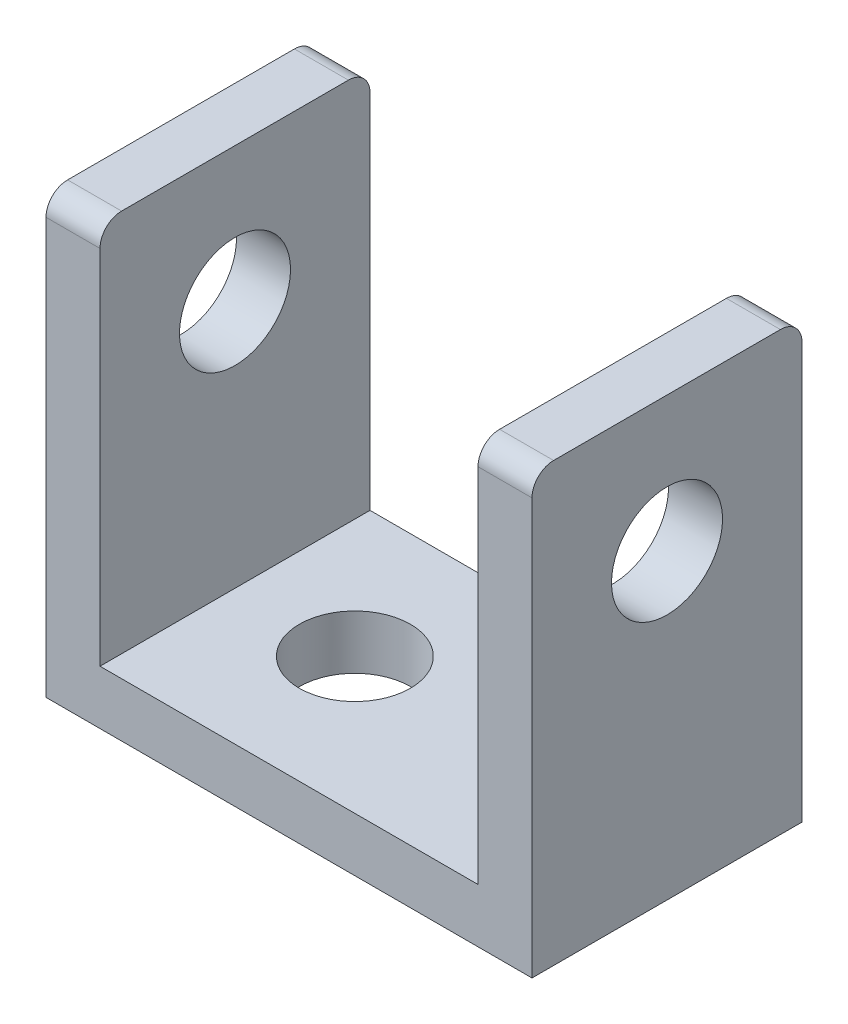
ISO-10303-21;
HEADER;
FILE_DESCRIPTION(('STEP AP214'),'2;1');
FILE_NAME('part.step','',(''),(''),'','','');
FILE_SCHEMA(('AUTOMOTIVE_DESIGN { 1 0 10303 214 1 1 1 1 }'));
ENDSEC;
DATA;
#1=APPLICATION_CONTEXT('core data for automotive mechanical design processes');
#2=APPLICATION_PROTOCOL_DEFINITION('international standard','automotive_design',2000,#1);
#3=PRODUCT_CONTEXT('',#1,'mechanical');
#4=PRODUCT('Part','Part','',(#3));
#5=PRODUCT_RELATED_PRODUCT_CATEGORY('part','',(#4));
#6=PRODUCT_DEFINITION_FORMATION('','',#4);
#7=PRODUCT_DEFINITION_CONTEXT('part definition',#1,'design');
#8=PRODUCT_DEFINITION('design','',#6,#7);
#9=PRODUCT_DEFINITION_SHAPE('','',#8);
#10=(LENGTH_UNIT() NAMED_UNIT(*) SI_UNIT(.MILLI.,.METRE.));
#11=(NAMED_UNIT(*) PLANE_ANGLE_UNIT() SI_UNIT($,.RADIAN.));
#12=(NAMED_UNIT(*) SI_UNIT($,.STERADIAN.) SOLID_ANGLE_UNIT());
#13=UNCERTAINTY_MEASURE_WITH_UNIT(LENGTH_MEASURE(1.E-05),#10,'distance_accuracy_value','');
#14=(GEOMETRIC_REPRESENTATION_CONTEXT(3) GLOBAL_UNCERTAINTY_ASSIGNED_CONTEXT((#13)) GLOBAL_UNIT_ASSIGNED_CONTEXT((#10,
#11,#12)) REPRESENTATION_CONTEXT('',''));
#15=CARTESIAN_POINT('',(0.,0.,0.));
#16=DIRECTION('',(0.,0.,1.));
#17=DIRECTION('',(1.,0.,0.));
#18=AXIS2_PLACEMENT_3D('',#15,#16,#17);
#19=CARTESIAN_POINT('',(28.575,6.6675,6.6675));
#20=DIRECTION('',(-1.,0.,0.));
#21=DIRECTION('',(0.,0.,-1.));
#22=AXIS2_PLACEMENT_3D('',#19,#20,#21);
#23=CYLINDRICAL_SURFACE('',#22,1.27);
#24=DIRECTION('',(-1.,0.,0.));
#25=VECTOR('',#24,1.);
#26=CARTESIAN_POINT('',(28.575,6.66749999999999,7.9375));
#27=LINE('',#26,#25);
#28=CARTESIAN_POINT('',(28.575,6.66749999999999,7.9375));
#29=VERTEX_POINT('',#28);
#30=CARTESIAN_POINT('',(25.4,6.6675,7.9375));
#31=VERTEX_POINT('',#30);
#32=EDGE_CURVE('E52',#29,#31,#27,.T.);
#33=ORIENTED_EDGE('',*,*,#32,.F.);
#34=CARTESIAN_POINT('',(28.575,6.6675,6.6675));
#35=DIRECTION('',(-1.,0.,0.));
#36=DIRECTION('',(0.,0.,1.));
#37=AXIS2_PLACEMENT_3D('',#34,#35,#36);
#38=CIRCLE('',#37,1.27);
#39=CARTESIAN_POINT('',(28.575,7.9375,6.66749999999999));
#40=VERTEX_POINT('',#39);
#41=EDGE_CURVE('E144',#29,#40,#38,.T.);
#42=ORIENTED_EDGE('',*,*,#41,.T.);
#43=DIRECTION('',(-1.,0.,0.));
#44=VECTOR('',#43,1.);
#45=CARTESIAN_POINT('',(28.575,7.9375,6.66749999999999));
#46=LINE('',#45,#44);
#47=CARTESIAN_POINT('',(25.4,7.9375,6.66749999999999));
#48=VERTEX_POINT('',#47);
#49=EDGE_CURVE('E174',#40,#48,#46,.T.);
#50=ORIENTED_EDGE('',*,*,#49,.T.);
#51=CARTESIAN_POINT('',(25.4,6.6675,6.6675));
#52=DIRECTION('',(-1.,0.,0.));
#53=DIRECTION('',(0.,0.,1.));
#54=AXIS2_PLACEMENT_3D('',#51,#52,#53);
#55=CIRCLE('',#54,1.27);
#56=EDGE_CURVE('E205',#31,#48,#55,.T.);
#57=ORIENTED_EDGE('',*,*,#56,.F.);
#58=EDGE_LOOP('',(#33,#42,#50,#57));
#59=FACE_BOUND('',#58,.T.);
#60=ADVANCED_FACE('F43',(#59),#23,.T.);
#61=CARTESIAN_POINT('',(28.575,7.9375,0.));
#62=DIRECTION('',(0.,1.,0.));
#63=DIRECTION('',(0.,0.,-1.));
#64=AXIS2_PLACEMENT_3D('',#61,#62,#63);
#65=PLANE('',#64);
#66=DIRECTION('',(0.,0.,1.));
#67=VECTOR('',#66,1.);
#68=CARTESIAN_POINT('',(25.4,7.9375,0.));
#69=LINE('',#68,#67);
#70=CARTESIAN_POINT('',(25.4,7.9375,-6.66749999999999));
#71=VERTEX_POINT('',#70);
#72=EDGE_CURVE('E202',#71,#48,#69,.T.);
#73=ORIENTED_EDGE('',*,*,#72,.T.);
#74=ORIENTED_EDGE('',*,*,#49,.F.);
#75=DIRECTION('',(0.,0.,1.));
#76=VECTOR('',#75,1.);
#77=CARTESIAN_POINT('',(28.575,7.9375,0.));
#78=LINE('',#77,#76);
#79=CARTESIAN_POINT('',(28.575,7.9375,-6.66749999999999));
#80=VERTEX_POINT('',#79);
#81=EDGE_CURVE('E142',#80,#40,#78,.T.);
#82=ORIENTED_EDGE('',*,*,#81,.F.);
#83=DIRECTION('',(-1.,0.,0.));
#84=VECTOR('',#83,1.);
#85=CARTESIAN_POINT('',(28.575,7.9375,-6.66749999999999));
#86=LINE('',#85,#84);
#87=EDGE_CURVE('E140',#80,#71,#86,.T.);
#88=ORIENTED_EDGE('',*,*,#87,.T.);
#89=EDGE_LOOP('',(#73,#74,#82,#88));
#90=FACE_BOUND('',#89,.T.);
#91=ADVANCED_FACE('F220',(#90),#65,.T.);
#92=CARTESIAN_POINT('',(28.575,6.6675,-6.6675));
#93=DIRECTION('',(-1.,0.,0.));
#94=DIRECTION('',(0.,0.,-1.));
#95=AXIS2_PLACEMENT_3D('',#92,#93,#94);
#96=CYLINDRICAL_SURFACE('',#95,1.27);
#97=CARTESIAN_POINT('',(25.4,6.6675,-6.6675));
#98=DIRECTION('',(-1.,0.,0.));
#99=DIRECTION('',(0.,0.,1.));
#100=AXIS2_PLACEMENT_3D('',#97,#98,#99);
#101=CIRCLE('',#100,1.27);
#102=CARTESIAN_POINT('',(25.4,6.66749999999999,-7.9375));
#103=VERTEX_POINT('',#102);
#104=EDGE_CURVE('E188',#103,#71,#101,.F.);
#105=ORIENTED_EDGE('',*,*,#104,.T.);
#106=ORIENTED_EDGE('',*,*,#87,.F.);
#107=CARTESIAN_POINT('',(28.575,6.6675,-6.6675));
#108=DIRECTION('',(-1.,0.,0.));
#109=DIRECTION('',(0.,0.,1.));
#110=AXIS2_PLACEMENT_3D('',#107,#108,#109);
#111=CIRCLE('',#110,1.27);
#112=CARTESIAN_POINT('',(28.575,6.66749999999999,-7.9375));
#113=VERTEX_POINT('',#112);
#114=EDGE_CURVE('E119',#113,#80,#111,.F.);
#115=ORIENTED_EDGE('',*,*,#114,.F.);
#116=DIRECTION('',(-1.,0.,0.));
#117=VECTOR('',#116,1.);
#118=CARTESIAN_POINT('',(28.575,6.66749999999999,-7.9375));
#119=LINE('',#118,#117);
#120=EDGE_CURVE('E126',#113,#103,#119,.T.);
#121=ORIENTED_EDGE('',*,*,#120,.T.);
#122=EDGE_LOOP('',(#105,#106,#115,#121));
#123=FACE_BOUND('',#122,.T.);
#124=ADVANCED_FACE('F138',(#123),#96,.T.);
#125=CARTESIAN_POINT('',(28.575,0.,0.));
#126=DIRECTION('',(-1.,0.,0.));
#127=DIRECTION('',(0.,0.,-1.));
#128=AXIS2_PLACEMENT_3D('',#125,#126,#127);
#129=CYLINDRICAL_SURFACE('',#128,3.2639);
#130=CARTESIAN_POINT('',(25.4,0.,0.));
#131=DIRECTION('',(-1.,0.,0.));
#132=DIRECTION('',(0.,0.,1.));
#133=AXIS2_PLACEMENT_3D('',#130,#131,#132);
#134=CIRCLE('',#133,3.2639);
#135=CARTESIAN_POINT('',(25.4,0.,3.2639));
#136=VERTEX_POINT('',#135);
#137=EDGE_CURVE('E183',#136,#136,#134,.T.);
#138=ORIENTED_EDGE('',*,*,#137,.T.);
#139=EDGE_LOOP('',(#138));
#140=FACE_BOUND('',#139,.T.);
#141=CARTESIAN_POINT('',(28.575,0.,0.));
#142=DIRECTION('',(-1.,0.,0.));
#143=DIRECTION('',(0.,0.,1.));
#144=AXIS2_PLACEMENT_3D('',#141,#142,#143);
#145=CIRCLE('',#144,3.2639);
#146=CARTESIAN_POINT('',(28.575,0.,3.2639));
#147=VERTEX_POINT('',#146);
#148=EDGE_CURVE('E149',#147,#147,#145,.T.);
#149=ORIENTED_EDGE('',*,*,#148,.F.);
#150=EDGE_LOOP('',(#149));
#151=FACE_BOUND('',#150,.T.);
#152=ADVANCED_FACE('F285',(#140,#151),#129,.F.);
#153=CARTESIAN_POINT('',(28.575,0.,7.9375));
#154=DIRECTION('',(0.,0.,-1.));
#155=DIRECTION('',(0.,-1.,0.));
#156=AXIS2_PLACEMENT_3D('',#153,#154,#155);
#157=PLANE('',#156);
#158=DIRECTION('',(1.,0.,0.));
#159=VECTOR('',#158,1.);
#160=CARTESIAN_POINT('',(28.575,-14.605,7.9375));
#161=LINE('',#160,#159);
#162=CARTESIAN_POINT('',(3.175,-14.605,7.9375));
#163=VERTEX_POINT('',#162);
#164=CARTESIAN_POINT('',(25.4,-14.605,7.9375));
#165=VERTEX_POINT('',#164);
#166=EDGE_CURVE('E156',#163,#165,#161,.T.);
#167=ORIENTED_EDGE('',*,*,#166,.F.);
#168=DIRECTION('',(0.,-1.,0.));
#169=VECTOR('',#168,1.);
#170=CARTESIAN_POINT('',(3.175,0.,7.9375));
#171=LINE('',#170,#169);
#172=CARTESIAN_POINT('',(3.175,6.66749999999999,7.9375));
#173=VERTEX_POINT('',#172);
#174=EDGE_CURVE('E185',#173,#163,#171,.T.);
#175=ORIENTED_EDGE('',*,*,#174,.F.);
#176=CARTESIAN_POINT('',(0.,6.66749999999999,7.9375));
#177=VERTEX_POINT('',#176);
#178=EDGE_CURVE('E177',#173,#177,#27,.T.);
#179=ORIENTED_EDGE('',*,*,#178,.T.);
#180=DIRECTION('',(0.,1.,0.));
#181=VECTOR('',#180,1.);
#182=CARTESIAN_POINT('',(0.,0.,7.9375));
#183=LINE('',#182,#181);
#184=CARTESIAN_POINT('',(0.,-17.78,7.9375));
#185=VERTEX_POINT('',#184);
#186=EDGE_CURVE('E153',#185,#177,#183,.T.);
#187=ORIENTED_EDGE('',*,*,#186,.F.);
#188=DIRECTION('',(-1.,0.,0.));
#189=VECTOR('',#188,1.);
#190=CARTESIAN_POINT('',(28.575,-17.78,7.9375));
#191=LINE('',#190,#189);
#192=CARTESIAN_POINT('',(28.575,-17.78,7.9375));
#193=VERTEX_POINT('',#192);
#194=EDGE_CURVE('E152',#193,#185,#191,.T.);
#195=ORIENTED_EDGE('',*,*,#194,.F.);
#196=DIRECTION('',(0.,1.,0.));
#197=VECTOR('',#196,1.);
#198=CARTESIAN_POINT('',(28.575,0.,7.9375));
#199=LINE('',#198,#197);
#200=EDGE_CURVE('E102',#193,#29,#199,.T.);
#201=ORIENTED_EDGE('',*,*,#200,.T.);
#202=ORIENTED_EDGE('',*,*,#32,.T.);
#203=DIRECTION('',(0.,1.,0.));
#204=VECTOR('',#203,1.);
#205=CARTESIAN_POINT('',(25.4,0.,7.9375));
#206=LINE('',#205,#204);
#207=EDGE_CURVE('E208',#165,#31,#206,.T.);
#208=ORIENTED_EDGE('',*,*,#207,.F.);
#209=EDGE_LOOP('',(#167,#175,#179,#187,#195,#201,#202,#208));
#210=FACE_BOUND('',#209,.T.);
#211=ADVANCED_FACE('F45',(#210),#157,.F.);
#212=CARTESIAN_POINT('',(3.175,7.9375,6.66749999999999));
#213=VERTEX_POINT('',#212);
#214=CARTESIAN_POINT('',(0.,7.9375,6.66749999999999));
#215=VERTEX_POINT('',#214);
#216=EDGE_CURVE('E173',#213,#215,#46,.T.);
#217=ORIENTED_EDGE('',*,*,#216,.T.);
#218=CARTESIAN_POINT('',(0.,6.6675,6.6675));
#219=DIRECTION('',(-1.,0.,0.));
#220=DIRECTION('',(0.,0.,1.));
#221=AXIS2_PLACEMENT_3D('',#218,#219,#220);
#222=CIRCLE('',#221,1.27);
#223=EDGE_CURVE('E155',#177,#215,#222,.T.);
#224=ORIENTED_EDGE('',*,*,#223,.F.);
#225=ORIENTED_EDGE('',*,*,#178,.F.);
#226=CARTESIAN_POINT('',(3.175,6.6675,6.6675));
#227=DIRECTION('',(1.,0.,0.));
#228=DIRECTION('',(0.,0.,-1.));
#229=AXIS2_PLACEMENT_3D('',#226,#227,#228);
#230=CIRCLE('',#229,1.27);
#231=EDGE_CURVE('E191',#213,#173,#230,.T.);
#232=ORIENTED_EDGE('',*,*,#231,.F.);
#233=EDGE_LOOP('',(#217,#224,#225,#232));
#234=FACE_BOUND('',#233,.T.);
#235=ADVANCED_FACE('F263',(#234),#23,.T.);
#236=DIRECTION('',(0.,0.,-1.));
#237=VECTOR('',#236,1.);
#238=CARTESIAN_POINT('',(3.175,7.9375,0.));
#239=LINE('',#238,#237);
#240=CARTESIAN_POINT('',(3.175,7.9375,-6.66749999999999));
#241=VERTEX_POINT('',#240);
#242=EDGE_CURVE('E197',#213,#241,#239,.T.);
#243=ORIENTED_EDGE('',*,*,#242,.T.);
#244=CARTESIAN_POINT('',(0.,7.9375,-6.66749999999999));
#245=VERTEX_POINT('',#244);
#246=EDGE_CURVE('E135',#241,#245,#86,.T.);
#247=ORIENTED_EDGE('',*,*,#246,.T.);
#248=DIRECTION('',(0.,0.,1.));
#249=VECTOR('',#248,1.);
#250=CARTESIAN_POINT('',(0.,7.9375,0.));
#251=LINE('',#250,#249);
#252=EDGE_CURVE('E159',#245,#215,#251,.T.);
#253=ORIENTED_EDGE('',*,*,#252,.T.);
#254=ORIENTED_EDGE('',*,*,#216,.F.);
#255=EDGE_LOOP('',(#243,#247,#253,#254));
#256=FACE_BOUND('',#255,.T.);
#257=ADVANCED_FACE('F253',(#256),#65,.T.);
#258=CARTESIAN_POINT('',(3.175,6.6675,-6.6675));
#259=DIRECTION('',(1.,0.,0.));
#260=DIRECTION('',(0.,0.,-1.));
#261=AXIS2_PLACEMENT_3D('',#258,#259,#260);
#262=CIRCLE('',#261,1.27);
#263=CARTESIAN_POINT('',(3.175,6.66749999999999,-7.9375));
#264=VERTEX_POINT('',#263);
#265=EDGE_CURVE('E245',#241,#264,#262,.F.);
#266=ORIENTED_EDGE('',*,*,#265,.T.);
#267=CARTESIAN_POINT('',(0.,6.66749999999999,-7.9375));
#268=VERTEX_POINT('',#267);
#269=EDGE_CURVE('E136',#264,#268,#119,.T.);
#270=ORIENTED_EDGE('',*,*,#269,.T.);
#271=CARTESIAN_POINT('',(0.,6.6675,-6.6675));
#272=DIRECTION('',(-1.,0.,0.));
#273=DIRECTION('',(0.,0.,1.));
#274=AXIS2_PLACEMENT_3D('',#271,#272,#273);
#275=CIRCLE('',#274,1.27);
#276=EDGE_CURVE('E161',#268,#245,#275,.F.);
#277=ORIENTED_EDGE('',*,*,#276,.T.);
#278=ORIENTED_EDGE('',*,*,#246,.F.);
#279=EDGE_LOOP('',(#266,#270,#277,#278));
#280=FACE_BOUND('',#279,.T.);
#281=ADVANCED_FACE('F273',(#280),#96,.T.);
#282=CARTESIAN_POINT('',(28.575,0.,-7.9375));
#283=DIRECTION('',(0.,0.,1.));
#284=DIRECTION('',(0.,1.,0.));
#285=AXIS2_PLACEMENT_3D('',#282,#283,#284);
#286=PLANE('',#285);
#287=ORIENTED_EDGE('',*,*,#120,.F.);
#288=DIRECTION('',(0.,-1.,0.));
#289=VECTOR('',#288,1.);
#290=CARTESIAN_POINT('',(28.575,0.,-7.9375));
#291=LINE('',#290,#289);
#292=CARTESIAN_POINT('',(28.575,-17.78,-7.9375));
#293=VERTEX_POINT('',#292);
#294=EDGE_CURVE('E114',#113,#293,#291,.T.);
#295=ORIENTED_EDGE('',*,*,#294,.T.);
#296=DIRECTION('',(-1.,0.,0.));
#297=VECTOR('',#296,1.);
#298=CARTESIAN_POINT('',(28.575,-17.78,-7.9375));
#299=LINE('',#298,#297);
#300=CARTESIAN_POINT('',(0.,-17.78,-7.9375));
#301=VERTEX_POINT('',#300);
#302=EDGE_CURVE('E170',#293,#301,#299,.T.);
#303=ORIENTED_EDGE('',*,*,#302,.T.);
#304=DIRECTION('',(0.,-1.,0.));
#305=VECTOR('',#304,1.);
#306=CARTESIAN_POINT('',(0.,0.,-7.9375));
#307=LINE('',#306,#305);
#308=EDGE_CURVE('E163',#268,#301,#307,.T.);
#309=ORIENTED_EDGE('',*,*,#308,.F.);
#310=ORIENTED_EDGE('',*,*,#269,.F.);
#311=DIRECTION('',(0.,1.,0.));
#312=VECTOR('',#311,1.);
#313=CARTESIAN_POINT('',(3.175,0.,-7.9375));
#314=LINE('',#313,#312);
#315=CARTESIAN_POINT('',(3.175,-14.605,-7.9375));
#316=VERTEX_POINT('',#315);
#317=EDGE_CURVE('E59',#316,#264,#314,.T.);
#318=ORIENTED_EDGE('',*,*,#317,.F.);
#319=DIRECTION('',(-1.,0.,0.));
#320=VECTOR('',#319,1.);
#321=CARTESIAN_POINT('',(28.575,-14.605,-7.9375));
#322=LINE('',#321,#320);
#323=CARTESIAN_POINT('',(25.4,-14.605,-7.9375));
#324=VERTEX_POINT('',#323);
#325=EDGE_CURVE('E11',#324,#316,#322,.T.);
#326=ORIENTED_EDGE('',*,*,#325,.F.);
#327=DIRECTION('',(0.,-1.,0.));
#328=VECTOR('',#327,1.);
#329=CARTESIAN_POINT('',(25.4,0.,-7.9375));
#330=LINE('',#329,#328);
#331=EDGE_CURVE('E131',#103,#324,#330,.T.);
#332=ORIENTED_EDGE('',*,*,#331,.F.);
#333=EDGE_LOOP('',(#287,#295,#303,#309,#310,#318,#326,#332));
#334=FACE_BOUND('',#333,.T.);
#335=ADVANCED_FACE('F127',(#334),#286,.F.);
#336=CARTESIAN_POINT('',(28.575,-17.78,0.));
#337=DIRECTION('',(0.,1.,0.));
#338=DIRECTION('',(0.,0.,-1.));
#339=AXIS2_PLACEMENT_3D('',#336,#337,#338);
#340=PLANE('',#339);
#341=CARTESIAN_POINT('',(10.16,-17.78,-0.0634999999999993));
#342=DIRECTION('',(0.,-1.,0.));
#343=DIRECTION('',(0.,0.,-1.));
#344=AXIS2_PLACEMENT_3D('',#341,#342,#343);
#345=CIRCLE('',#344,3.2639);
#346=CARTESIAN_POINT('',(10.16,-17.78,-3.3274));
#347=VERTEX_POINT('',#346);
#348=EDGE_CURVE('E241',#347,#347,#345,.T.);
#349=ORIENTED_EDGE('',*,*,#348,.F.);
#350=EDGE_LOOP('',(#349));
#351=FACE_BOUND('',#350,.T.);
#352=DIRECTION('',(0.,0.,1.));
#353=VECTOR('',#352,1.);
#354=CARTESIAN_POINT('',(0.,-17.78,0.));
#355=LINE('',#354,#353);
#356=EDGE_CURVE('E95',#301,#185,#355,.T.);
#357=ORIENTED_EDGE('',*,*,#356,.F.);
#358=ORIENTED_EDGE('',*,*,#302,.F.);
#359=DIRECTION('',(0.,0.,1.));
#360=VECTOR('',#359,1.);
#361=CARTESIAN_POINT('',(28.575,-17.78,0.));
#362=LINE('',#361,#360);
#363=EDGE_CURVE('E68',#293,#193,#362,.T.);
#364=ORIENTED_EDGE('',*,*,#363,.T.);
#365=ORIENTED_EDGE('',*,*,#194,.T.);
#366=EDGE_LOOP('',(#357,#358,#364,#365));
#367=FACE_BOUND('',#366,.T.);
#368=ADVANCED_FACE('F274',(#351,#367),#340,.F.);
#369=CARTESIAN_POINT('',(3.175,0.,0.));
#370=DIRECTION('',(1.,0.,0.));
#371=DIRECTION('',(0.,0.,-1.));
#372=AXIS2_PLACEMENT_3D('',#369,#370,#371);
#373=CIRCLE('',#372,3.2639);
#374=CARTESIAN_POINT('',(3.175,0.,-3.2639));
#375=VERTEX_POINT('',#374);
#376=EDGE_CURVE('E179',#375,#375,#373,.T.);
#377=ORIENTED_EDGE('',*,*,#376,.T.);
#378=EDGE_LOOP('',(#377));
#379=FACE_BOUND('',#378,.T.);
#380=CARTESIAN_POINT('',(0.,0.,0.));
#381=DIRECTION('',(-1.,0.,0.));
#382=DIRECTION('',(0.,0.,1.));
#383=AXIS2_PLACEMENT_3D('',#380,#381,#382);
#384=CIRCLE('',#383,3.2639);
#385=CARTESIAN_POINT('',(0.,0.,3.2639));
#386=VERTEX_POINT('',#385);
#387=EDGE_CURVE('E166',#386,#386,#384,.T.);
#388=ORIENTED_EDGE('',*,*,#387,.T.);
#389=EDGE_LOOP('',(#388));
#390=FACE_BOUND('',#389,.T.);
#391=ADVANCED_FACE('F276',(#379,#390),#129,.F.);
#392=CARTESIAN_POINT('',(28.575,0.,0.));
#393=DIRECTION('',(1.,0.,0.));
#394=DIRECTION('',(0.,0.,1.));
#395=AXIS2_PLACEMENT_3D('',#392,#393,#394);
#396=PLANE('',#395);
#397=ORIENTED_EDGE('',*,*,#200,.F.);
#398=ORIENTED_EDGE('',*,*,#363,.F.);
#399=ORIENTED_EDGE('',*,*,#294,.F.);
#400=ORIENTED_EDGE('',*,*,#114,.T.);
#401=ORIENTED_EDGE('',*,*,#81,.T.);
#402=ORIENTED_EDGE('',*,*,#41,.F.);
#403=EDGE_LOOP('',(#397,#398,#399,#400,#401,#402));
#404=FACE_BOUND('',#403,.T.);
#405=ORIENTED_EDGE('',*,*,#148,.T.);
#406=EDGE_LOOP('',(#405));
#407=FACE_BOUND('',#406,.T.);
#408=ADVANCED_FACE('F116',(#404,#407),#396,.T.);
#409=CARTESIAN_POINT('',(0.,0.,0.));
#410=DIRECTION('',(1.,0.,0.));
#411=DIRECTION('',(0.,0.,1.));
#412=AXIS2_PLACEMENT_3D('',#409,#410,#411);
#413=PLANE('',#412);
#414=ORIENTED_EDGE('',*,*,#186,.T.);
#415=ORIENTED_EDGE('',*,*,#223,.T.);
#416=ORIENTED_EDGE('',*,*,#252,.F.);
#417=ORIENTED_EDGE('',*,*,#276,.F.);
#418=ORIENTED_EDGE('',*,*,#308,.T.);
#419=ORIENTED_EDGE('',*,*,#356,.T.);
#420=EDGE_LOOP('',(#414,#415,#416,#417,#418,#419));
#421=FACE_BOUND('',#420,.T.);
#422=ORIENTED_EDGE('',*,*,#387,.F.);
#423=EDGE_LOOP('',(#422));
#424=FACE_BOUND('',#423,.T.);
#425=ADVANCED_FACE('F267',(#421,#424),#413,.F.);
#426=CARTESIAN_POINT('',(3.175,-14.605,12.7));
#427=DIRECTION('',(0.,-1.,0.));
#428=DIRECTION('',(0.,0.,1.));
#429=AXIS2_PLACEMENT_3D('',#426,#427,#428);
#430=PLANE('',#429);
#431=CARTESIAN_POINT('',(10.16,-14.605,-0.0634999999999993));
#432=DIRECTION('',(0.,1.,0.));
#433=DIRECTION('',(0.,0.,1.));
#434=AXIS2_PLACEMENT_3D('',#431,#432,#433);
#435=CIRCLE('',#434,3.2639);
#436=CARTESIAN_POINT('',(10.16,-14.605,3.2004));
#437=VERTEX_POINT('',#436);
#438=EDGE_CURVE('E47',#437,#437,#435,.T.);
#439=ORIENTED_EDGE('',*,*,#438,.F.);
#440=EDGE_LOOP('',(#439));
#441=FACE_BOUND('',#440,.T.);
#442=DIRECTION('',(0.,0.,-1.));
#443=VECTOR('',#442,1.);
#444=CARTESIAN_POINT('',(3.175,-14.605,12.7));
#445=LINE('',#444,#443);
#446=EDGE_CURVE('E235',#163,#316,#445,.T.);
#447=ORIENTED_EDGE('',*,*,#446,.F.);
#448=ORIENTED_EDGE('',*,*,#166,.T.);
#449=DIRECTION('',(0.,0.,-1.));
#450=VECTOR('',#449,1.);
#451=CARTESIAN_POINT('',(25.4,-14.605,12.7));
#452=LINE('',#451,#450);
#453=EDGE_CURVE('E182',#165,#324,#452,.T.);
#454=ORIENTED_EDGE('',*,*,#453,.T.);
#455=ORIENTED_EDGE('',*,*,#325,.T.);
#456=EDGE_LOOP('',(#447,#448,#454,#455));
#457=FACE_BOUND('',#456,.T.);
#458=ADVANCED_FACE('F234',(#441,#457),#430,.F.);
#459=CARTESIAN_POINT('',(25.4,-14.605,12.7));
#460=DIRECTION('',(1.,0.,0.));
#461=DIRECTION('',(0.,0.,1.));
#462=AXIS2_PLACEMENT_3D('',#459,#460,#461);
#463=PLANE('',#462);
#464=ORIENTED_EDGE('',*,*,#137,.F.);
#465=EDGE_LOOP('',(#464));
#466=FACE_BOUND('',#465,.T.);
#467=ORIENTED_EDGE('',*,*,#453,.F.);
#468=ORIENTED_EDGE('',*,*,#207,.T.);
#469=ORIENTED_EDGE('',*,*,#56,.T.);
#470=ORIENTED_EDGE('',*,*,#72,.F.);
#471=ORIENTED_EDGE('',*,*,#104,.F.);
#472=ORIENTED_EDGE('',*,*,#331,.T.);
#473=EDGE_LOOP('',(#467,#468,#469,#470,#471,#472));
#474=FACE_BOUND('',#473,.T.);
#475=ADVANCED_FACE('F225',(#466,#474),#463,.F.);
#476=CARTESIAN_POINT('',(3.175,-14.605,12.7));
#477=DIRECTION('',(-1.,0.,0.));
#478=DIRECTION('',(0.,0.,-1.));
#479=AXIS2_PLACEMENT_3D('',#476,#477,#478);
#480=PLANE('',#479);
#481=ORIENTED_EDGE('',*,*,#376,.F.);
#482=EDGE_LOOP('',(#481));
#483=FACE_BOUND('',#482,.T.);
#484=ORIENTED_EDGE('',*,*,#231,.T.);
#485=ORIENTED_EDGE('',*,*,#174,.T.);
#486=ORIENTED_EDGE('',*,*,#446,.T.);
#487=ORIENTED_EDGE('',*,*,#317,.T.);
#488=ORIENTED_EDGE('',*,*,#265,.F.);
#489=ORIENTED_EDGE('',*,*,#242,.F.);
#490=EDGE_LOOP('',(#484,#485,#486,#487,#488,#489));
#491=FACE_BOUND('',#490,.T.);
#492=ADVANCED_FACE('F259',(#483,#491),#480,.F.);
#493=CARTESIAN_POINT('',(10.16,-17.78,-0.0634999999999993));
#494=DIRECTION('',(0.,1.,0.));
#495=DIRECTION('',(0.,0.,-1.));
#496=AXIS2_PLACEMENT_3D('',#493,#494,#495);
#497=CYLINDRICAL_SURFACE('',#496,3.2639);
#498=ORIENTED_EDGE('',*,*,#348,.T.);
#499=EDGE_LOOP('',(#498));
#500=FACE_BOUND('',#499,.T.);
#501=ORIENTED_EDGE('',*,*,#438,.T.);
#502=EDGE_LOOP('',(#501));
#503=FACE_BOUND('',#502,.T.);
#504=ADVANCED_FACE('F316',(#500,#503),#497,.F.);
#505=CLOSED_SHELL('',(#60,#91,#124,#152,#211,#235,#257,#281,#335,#368,#391,#408,#425,#458,#475,
#492,#504));
#506=MANIFOLD_SOLID_BREP('B2',#505);
#507=ADVANCED_BREP_SHAPE_REPRESENTATION('',(#18,#506),#14);
#508=SHAPE_DEFINITION_REPRESENTATION(#9,#507);
ENDSEC;
END-ISO-10303-21;
